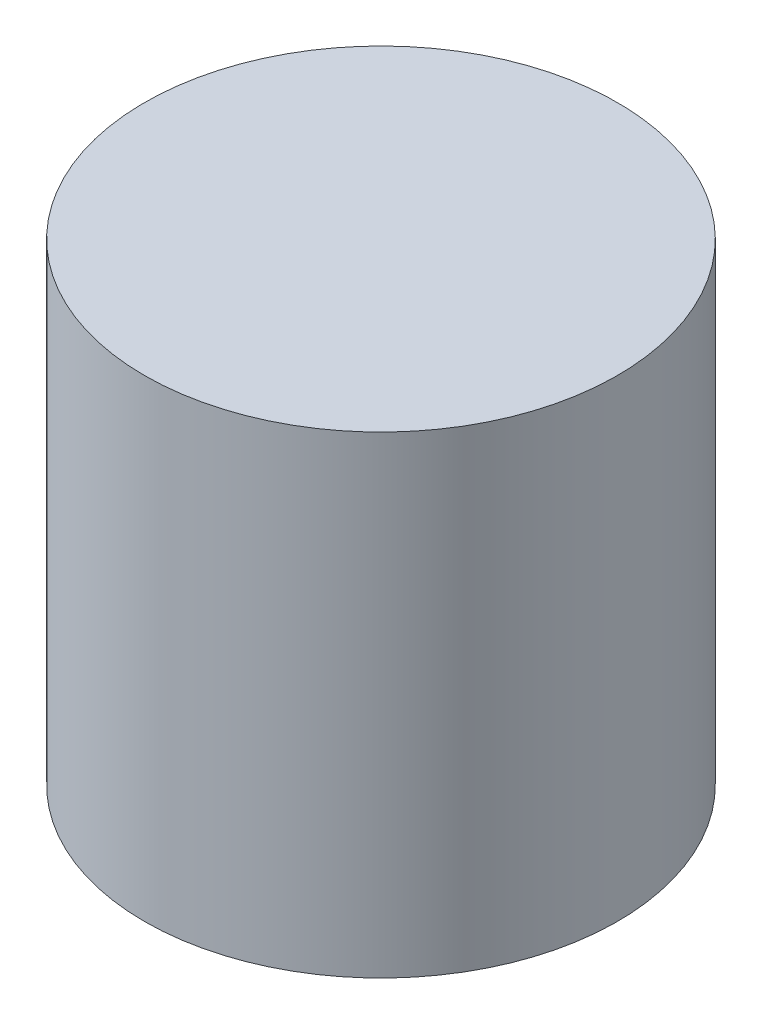
ISO-10303-21;
HEADER;
FILE_DESCRIPTION(('STEP AP214'),'2;1');
FILE_NAME('part.step','',(''),(''),'','','');
FILE_SCHEMA(('AUTOMOTIVE_DESIGN { 1 0 10303 214 1 1 1 1 }'));
ENDSEC;
DATA;
#1=APPLICATION_CONTEXT('core data for automotive mechanical design processes');
#2=APPLICATION_PROTOCOL_DEFINITION('international standard','automotive_design',2000,#1);
#3=PRODUCT_CONTEXT('',#1,'mechanical');
#4=PRODUCT('Part','Part','',(#3));
#5=PRODUCT_RELATED_PRODUCT_CATEGORY('part','',(#4));
#6=PRODUCT_DEFINITION_FORMATION('','',#4);
#7=PRODUCT_DEFINITION_CONTEXT('part definition',#1,'design');
#8=PRODUCT_DEFINITION('design','',#6,#7);
#9=PRODUCT_DEFINITION_SHAPE('','',#8);
#10=(LENGTH_UNIT() NAMED_UNIT(*) SI_UNIT(.MILLI.,.METRE.));
#11=(NAMED_UNIT(*) PLANE_ANGLE_UNIT() SI_UNIT($,.RADIAN.));
#12=(NAMED_UNIT(*) SI_UNIT($,.STERADIAN.) SOLID_ANGLE_UNIT());
#13=UNCERTAINTY_MEASURE_WITH_UNIT(LENGTH_MEASURE(1.E-05),#10,'distance_accuracy_value','');
#14=(GEOMETRIC_REPRESENTATION_CONTEXT(3) GLOBAL_UNCERTAINTY_ASSIGNED_CONTEXT((#13)) GLOBAL_UNIT_ASSIGNED_CONTEXT((#10,
#11,#12)) REPRESENTATION_CONTEXT('',''));
#15=CARTESIAN_POINT('',(0.,0.,0.));
#16=DIRECTION('',(0.,0.,1.));
#17=DIRECTION('',(1.,0.,0.));
#18=AXIS2_PLACEMENT_3D('',#15,#16,#17);
#19=CARTESIAN_POINT('',(0.,8.,0.));
#20=DIRECTION('',(0.,-1.,0.));
#21=DIRECTION('',(0.,0.,-1.));
#22=AXIS2_PLACEMENT_3D('',#19,#20,#21);
#23=CYLINDRICAL_SURFACE('',#22,4.);
#24=CARTESIAN_POINT('',(0.,8.,0.));
#25=DIRECTION('',(0.,1.,0.));
#26=DIRECTION('',(0.,0.,1.));
#27=AXIS2_PLACEMENT_3D('',#24,#25,#26);
#28=CIRCLE('',#27,4.);
#29=CARTESIAN_POINT('',(0.,8.,4.));
#30=VERTEX_POINT('',#29);
#31=EDGE_CURVE('E10',#30,#30,#28,.T.);
#32=ORIENTED_EDGE('',*,*,#31,.F.);
#33=EDGE_LOOP('',(#32));
#34=FACE_BOUND('',#33,.T.);
#35=CARTESIAN_POINT('',(0.,0.,0.));
#36=DIRECTION('',(0.,1.,0.));
#37=DIRECTION('',(0.,0.,1.));
#38=AXIS2_PLACEMENT_3D('',#35,#36,#37);
#39=CIRCLE('',#38,4.);
#40=CARTESIAN_POINT('',(0.,0.,4.));
#41=VERTEX_POINT('',#40);
#42=EDGE_CURVE('E34',#41,#41,#39,.T.);
#43=ORIENTED_EDGE('',*,*,#42,.T.);
#44=EDGE_LOOP('',(#43));
#45=FACE_BOUND('',#44,.T.);
#46=ADVANCED_FACE('F31',(#34,#45),#23,.T.);
#47=CARTESIAN_POINT('',(0.,8.,0.));
#48=DIRECTION('',(0.,1.,0.));
#49=DIRECTION('',(0.,0.,1.));
#50=AXIS2_PLACEMENT_3D('',#47,#48,#49);
#51=PLANE('',#50);
#52=ORIENTED_EDGE('',*,*,#31,.T.);
#53=EDGE_LOOP('',(#52));
#54=FACE_BOUND('',#53,.T.);
#55=ADVANCED_FACE('F46',(#54),#51,.T.);
#56=CARTESIAN_POINT('',(0.,0.,0.));
#57=DIRECTION('',(0.,1.,0.));
#58=DIRECTION('',(0.,0.,1.));
#59=AXIS2_PLACEMENT_3D('',#56,#57,#58);
#60=PLANE('',#59);
#61=ORIENTED_EDGE('',*,*,#42,.F.);
#62=EDGE_LOOP('',(#61));
#63=FACE_BOUND('',#62,.T.);
#64=ADVANCED_FACE('F44',(#63),#60,.F.);
#65=CLOSED_SHELL('',(#46,#55,#64));
#66=MANIFOLD_SOLID_BREP('B2',#65);
#67=ADVANCED_BREP_SHAPE_REPRESENTATION('',(#18,#66),#14);
#68=SHAPE_DEFINITION_REPRESENTATION(#9,#67);
ENDSEC;
END-ISO-10303-21;
